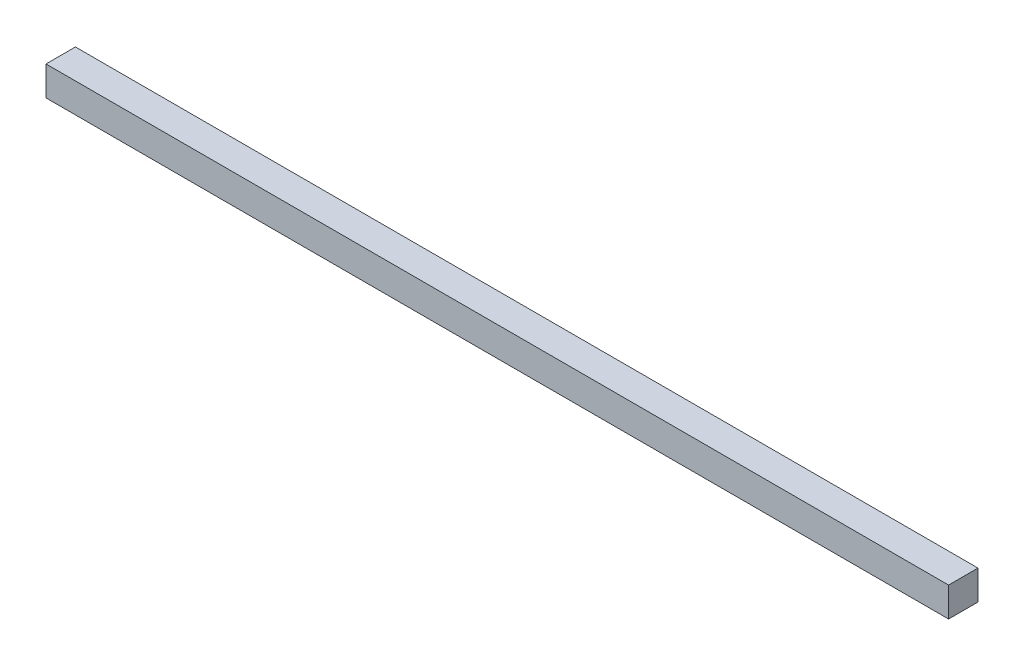
ISO-10303-21;
HEADER;
FILE_DESCRIPTION(('STEP AP214'),'2;1');
FILE_NAME('part.step','',(''),(''),'','','');
FILE_SCHEMA(('AUTOMOTIVE_DESIGN { 1 0 10303 214 1 1 1 1 }'));
ENDSEC;
DATA;
#1=APPLICATION_CONTEXT('core data for automotive mechanical design processes');
#2=APPLICATION_PROTOCOL_DEFINITION('international standard','automotive_design',2000,#1);
#3=PRODUCT_CONTEXT('',#1,'mechanical');
#4=PRODUCT('Part','Part','',(#3));
#5=PRODUCT_RELATED_PRODUCT_CATEGORY('part','',(#4));
#6=PRODUCT_DEFINITION_FORMATION('','',#4);
#7=PRODUCT_DEFINITION_CONTEXT('part definition',#1,'design');
#8=PRODUCT_DEFINITION('design','',#6,#7);
#9=PRODUCT_DEFINITION_SHAPE('','',#8);
#10=(LENGTH_UNIT() NAMED_UNIT(*) SI_UNIT(.MILLI.,.METRE.));
#11=(NAMED_UNIT(*) PLANE_ANGLE_UNIT() SI_UNIT($,.RADIAN.));
#12=(NAMED_UNIT(*) SI_UNIT($,.STERADIAN.) SOLID_ANGLE_UNIT());
#13=UNCERTAINTY_MEASURE_WITH_UNIT(LENGTH_MEASURE(1.E-05),#10,'distance_accuracy_value','');
#14=(GEOMETRIC_REPRESENTATION_CONTEXT(3) GLOBAL_UNCERTAINTY_ASSIGNED_CONTEXT((#13)) GLOBAL_UNIT_ASSIGNED_CONTEXT((#10,
#11,#12)) REPRESENTATION_CONTEXT('',''));
#15=CARTESIAN_POINT('',(0.,0.,0.));
#16=DIRECTION('',(0.,0.,1.));
#17=DIRECTION('',(1.,0.,0.));
#18=AXIS2_PLACEMENT_3D('',#15,#16,#17);
#19=CARTESIAN_POINT('',(-584.2,19.0500000000001,38.1));
#20=DIRECTION('',(1.,0.,0.));
#21=DIRECTION('',(0.,0.,-1.));
#22=AXIS2_PLACEMENT_3D('',#19,#20,#21);
#23=PLANE('',#22);
#24=DIRECTION('',(0.,-1.,0.));
#25=VECTOR('',#24,1.);
#26=CARTESIAN_POINT('',(-584.2,19.0500000000001,0.));
#27=LINE('',#26,#25);
#28=CARTESIAN_POINT('',(-584.2,19.0500000000001,0.));
#29=VERTEX_POINT('',#28);
#30=CARTESIAN_POINT('',(-584.2,-19.0500000000001,0.));
#31=VERTEX_POINT('',#30);
#32=EDGE_CURVE('E96',#29,#31,#27,.T.);
#33=ORIENTED_EDGE('',*,*,#32,.T.);
#34=DIRECTION('',(0.,0.,-1.));
#35=VECTOR('',#34,1.);
#36=CARTESIAN_POINT('',(-584.2,-19.0500000000001,38.1));
#37=LINE('',#36,#35);
#38=CARTESIAN_POINT('',(-584.2,-19.0500000000001,38.1));
#39=VERTEX_POINT('',#38);
#40=EDGE_CURVE('E11',#39,#31,#37,.T.);
#41=ORIENTED_EDGE('',*,*,#40,.F.);
#42=DIRECTION('',(0.,-1.,0.));
#43=VECTOR('',#42,1.);
#44=CARTESIAN_POINT('',(-584.2,19.0500000000001,38.1));
#45=LINE('',#44,#43);
#46=CARTESIAN_POINT('',(-584.2,19.0500000000001,38.1));
#47=VERTEX_POINT('',#46);
#48=EDGE_CURVE('E84',#47,#39,#45,.T.);
#49=ORIENTED_EDGE('',*,*,#48,.F.);
#50=DIRECTION('',(0.,0.,-1.));
#51=VECTOR('',#50,1.);
#52=CARTESIAN_POINT('',(-584.2,19.0500000000001,38.1));
#53=LINE('',#52,#51);
#54=EDGE_CURVE('E92',#47,#29,#53,.T.);
#55=ORIENTED_EDGE('',*,*,#54,.T.);
#56=EDGE_LOOP('',(#33,#41,#49,#55));
#57=FACE_BOUND('',#56,.T.);
#58=ADVANCED_FACE('F33',(#57),#23,.F.);
#59=CARTESIAN_POINT('',(-584.2,-19.0500000000001,38.1));
#60=DIRECTION('',(0.,1.,0.));
#61=DIRECTION('',(-1.,0.,0.));
#62=AXIS2_PLACEMENT_3D('',#59,#60,#61);
#63=PLANE('',#62);
#64=DIRECTION('',(1.,0.,0.));
#65=VECTOR('',#64,1.);
#66=CARTESIAN_POINT('',(-584.2,-19.0500000000001,0.));
#67=LINE('',#66,#65);
#68=CARTESIAN_POINT('',(584.2,-19.05,0.));
#69=VERTEX_POINT('',#68);
#70=EDGE_CURVE('E88',#31,#69,#67,.T.);
#71=ORIENTED_EDGE('',*,*,#70,.T.);
#72=DIRECTION('',(0.,0.,-1.));
#73=VECTOR('',#72,1.);
#74=CARTESIAN_POINT('',(584.2,-19.05,38.1));
#75=LINE('',#74,#73);
#76=CARTESIAN_POINT('',(584.2,-19.05,38.1));
#77=VERTEX_POINT('',#76);
#78=EDGE_CURVE('E41',#77,#69,#75,.T.);
#79=ORIENTED_EDGE('',*,*,#78,.F.);
#80=DIRECTION('',(1.,0.,0.));
#81=VECTOR('',#80,1.);
#82=CARTESIAN_POINT('',(-584.2,-19.0500000000001,38.1));
#83=LINE('',#82,#81);
#84=EDGE_CURVE('E79',#39,#77,#83,.T.);
#85=ORIENTED_EDGE('',*,*,#84,.F.);
#86=ORIENTED_EDGE('',*,*,#40,.T.);
#87=EDGE_LOOP('',(#71,#79,#85,#86));
#88=FACE_BOUND('',#87,.T.);
#89=ADVANCED_FACE('F87',(#88),#63,.F.);
#90=CARTESIAN_POINT('',(584.2,19.05,38.1));
#91=DIRECTION('',(-1.,0.,0.));
#92=DIRECTION('',(0.,0.,1.));
#93=AXIS2_PLACEMENT_3D('',#90,#91,#92);
#94=PLANE('',#93);
#95=DIRECTION('',(0.,1.,0.));
#96=VECTOR('',#95,1.);
#97=CARTESIAN_POINT('',(584.2,19.05,0.));
#98=LINE('',#97,#96);
#99=CARTESIAN_POINT('',(584.2,19.05,0.));
#100=VERTEX_POINT('',#99);
#101=EDGE_CURVE('E66',#69,#100,#98,.T.);
#102=ORIENTED_EDGE('',*,*,#101,.T.);
#103=DIRECTION('',(0.,0.,-1.));
#104=VECTOR('',#103,1.);
#105=CARTESIAN_POINT('',(584.2,19.05,38.1));
#106=LINE('',#105,#104);
#107=CARTESIAN_POINT('',(584.2,19.05,38.1));
#108=VERTEX_POINT('',#107);
#109=EDGE_CURVE('E89',#108,#100,#106,.T.);
#110=ORIENTED_EDGE('',*,*,#109,.F.);
#111=DIRECTION('',(0.,1.,0.));
#112=VECTOR('',#111,1.);
#113=CARTESIAN_POINT('',(584.2,19.05,38.1));
#114=LINE('',#113,#112);
#115=EDGE_CURVE('E82',#77,#108,#114,.T.);
#116=ORIENTED_EDGE('',*,*,#115,.F.);
#117=ORIENTED_EDGE('',*,*,#78,.T.);
#118=EDGE_LOOP('',(#102,#110,#116,#117));
#119=FACE_BOUND('',#118,.T.);
#120=ADVANCED_FACE('F90',(#119),#94,.F.);
#121=CARTESIAN_POINT('',(-584.2,19.0500000000001,38.1));
#122=DIRECTION('',(0.,-1.,0.));
#123=DIRECTION('',(1.,0.,0.));
#124=AXIS2_PLACEMENT_3D('',#121,#122,#123);
#125=PLANE('',#124);
#126=DIRECTION('',(-1.,0.,0.));
#127=VECTOR('',#126,1.);
#128=CARTESIAN_POINT('',(-584.2,19.0500000000001,0.));
#129=LINE('',#128,#127);
#130=EDGE_CURVE('E72',#100,#29,#129,.T.);
#131=ORIENTED_EDGE('',*,*,#130,.T.);
#132=ORIENTED_EDGE('',*,*,#54,.F.);
#133=DIRECTION('',(-1.,0.,0.));
#134=VECTOR('',#133,1.);
#135=CARTESIAN_POINT('',(-584.2,19.0500000000001,38.1));
#136=LINE('',#135,#134);
#137=EDGE_CURVE('E49',#108,#47,#136,.T.);
#138=ORIENTED_EDGE('',*,*,#137,.F.);
#139=ORIENTED_EDGE('',*,*,#109,.T.);
#140=EDGE_LOOP('',(#131,#132,#138,#139));
#141=FACE_BOUND('',#140,.T.);
#142=ADVANCED_FACE('F103',(#141),#125,.F.);
#143=CARTESIAN_POINT('',(0.,0.,38.1));
#144=DIRECTION('',(0.,0.,1.));
#145=DIRECTION('',(1.,0.,0.));
#146=AXIS2_PLACEMENT_3D('',#143,#144,#145);
#147=PLANE('',#146);
#148=ORIENTED_EDGE('',*,*,#48,.T.);
#149=ORIENTED_EDGE('',*,*,#84,.T.);
#150=ORIENTED_EDGE('',*,*,#115,.T.);
#151=ORIENTED_EDGE('',*,*,#137,.T.);
#152=EDGE_LOOP('',(#148,#149,#150,#151));
#153=FACE_BOUND('',#152,.T.);
#154=ADVANCED_FACE('F80',(#153),#147,.T.);
#155=CARTESIAN_POINT('',(0.,0.,0.));
#156=DIRECTION('',(0.,0.,1.));
#157=DIRECTION('',(1.,0.,0.));
#158=AXIS2_PLACEMENT_3D('',#155,#156,#157);
#159=PLANE('',#158);
#160=ORIENTED_EDGE('',*,*,#32,.F.);
#161=ORIENTED_EDGE('',*,*,#130,.F.);
#162=ORIENTED_EDGE('',*,*,#101,.F.);
#163=ORIENTED_EDGE('',*,*,#70,.F.);
#164=EDGE_LOOP('',(#160,#161,#162,#163));
#165=FACE_BOUND('',#164,.T.);
#166=ADVANCED_FACE('F106',(#165),#159,.F.);
#167=CLOSED_SHELL('',(#58,#89,#120,#142,#154,#166));
#168=MANIFOLD_SOLID_BREP('B2',#167);
#169=ADVANCED_BREP_SHAPE_REPRESENTATION('',(#18,#168),#14);
#170=SHAPE_DEFINITION_REPRESENTATION(#9,#169);
ENDSEC;
END-ISO-10303-21;
